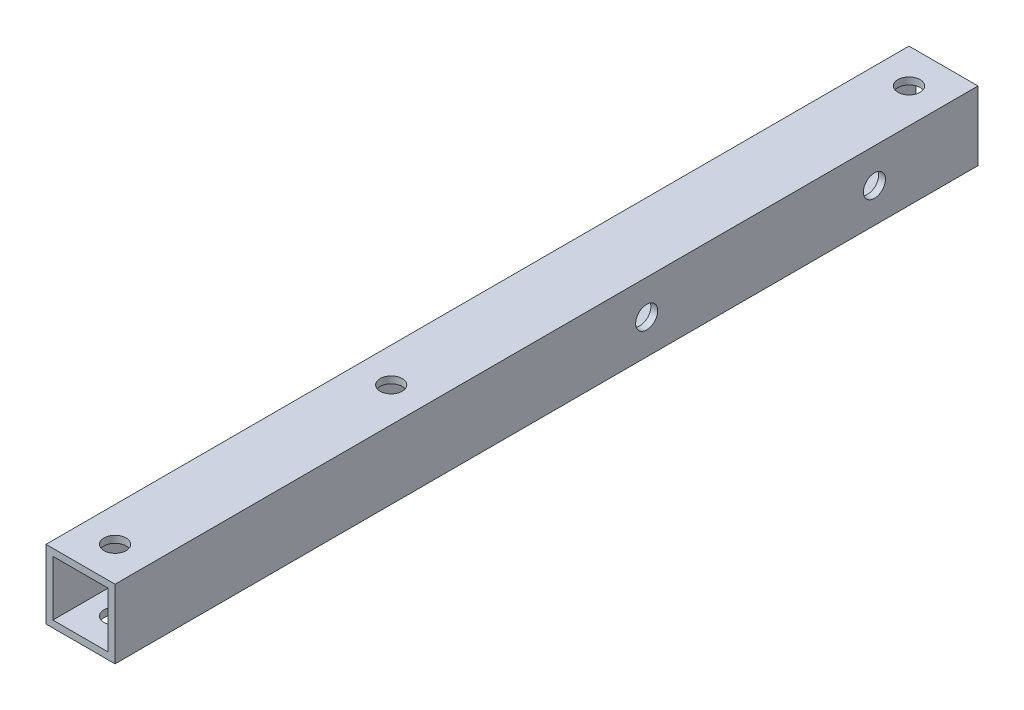
ISO-10303-21;
HEADER;
FILE_DESCRIPTION(('STEP AP214'),'2;1');
FILE_NAME('part.step','',(''),(''),'','','');
FILE_SCHEMA(('AUTOMOTIVE_DESIGN { 1 0 10303 214 1 1 1 1 }'));
ENDSEC;
DATA;
#1=APPLICATION_CONTEXT('core data for automotive mechanical design processes');
#2=APPLICATION_PROTOCOL_DEFINITION('international standard','automotive_design',2000,#1);
#3=PRODUCT_CONTEXT('',#1,'mechanical');
#4=PRODUCT('Part','Part','',(#3));
#5=PRODUCT_RELATED_PRODUCT_CATEGORY('part','',(#4));
#6=PRODUCT_DEFINITION_FORMATION('','',#4);
#7=PRODUCT_DEFINITION_CONTEXT('part definition',#1,'design');
#8=PRODUCT_DEFINITION('design','',#6,#7);
#9=PRODUCT_DEFINITION_SHAPE('','',#8);
#10=(LENGTH_UNIT() NAMED_UNIT(*) SI_UNIT(.MILLI.,.METRE.));
#11=(NAMED_UNIT(*) PLANE_ANGLE_UNIT() SI_UNIT($,.RADIAN.));
#12=(NAMED_UNIT(*) SI_UNIT($,.STERADIAN.) SOLID_ANGLE_UNIT());
#13=UNCERTAINTY_MEASURE_WITH_UNIT(LENGTH_MEASURE(1.E-05),#10,'distance_accuracy_value','');
#14=(GEOMETRIC_REPRESENTATION_CONTEXT(3) GLOBAL_UNCERTAINTY_ASSIGNED_CONTEXT((#13)) GLOBAL_UNIT_ASSIGNED_CONTEXT((#10,
#11,#12)) REPRESENTATION_CONTEXT('',''));
#15=CARTESIAN_POINT('',(0.,0.,0.));
#16=DIRECTION('',(0.,0.,1.));
#17=DIRECTION('',(1.,0.,0.));
#18=AXIS2_PLACEMENT_3D('',#15,#16,#17);
#19=CARTESIAN_POINT('',(0.,0.,125.));
#20=DIRECTION('',(0.,0.,1.));
#21=DIRECTION('',(1.,0.,0.));
#22=AXIS2_PLACEMENT_3D('',#19,#20,#21);
#23=PLANE('',#22);
#24=DIRECTION('',(0.,1.,0.));
#25=VECTOR('',#24,1.);
#26=CARTESIAN_POINT('',(5.,5.,125.));
#27=LINE('',#26,#25);
#28=CARTESIAN_POINT('',(5.,-5.,125.));
#29=VERTEX_POINT('',#28);
#30=CARTESIAN_POINT('',(5.,5.,125.));
#31=VERTEX_POINT('',#30);
#32=EDGE_CURVE('E140',#29,#31,#27,.T.);
#33=ORIENTED_EDGE('',*,*,#32,.T.);
#34=DIRECTION('',(-1.,0.,0.));
#35=VECTOR('',#34,1.);
#36=CARTESIAN_POINT('',(-5.,5.,125.));
#37=LINE('',#36,#35);
#38=CARTESIAN_POINT('',(-5.,5.,125.));
#39=VERTEX_POINT('',#38);
#40=EDGE_CURVE('E143',#31,#39,#37,.T.);
#41=ORIENTED_EDGE('',*,*,#40,.T.);
#42=DIRECTION('',(0.,-1.,0.));
#43=VECTOR('',#42,1.);
#44=CARTESIAN_POINT('',(-5.,5.,125.));
#45=LINE('',#44,#43);
#46=CARTESIAN_POINT('',(-5.,-5.,125.));
#47=VERTEX_POINT('',#46);
#48=EDGE_CURVE('E146',#39,#47,#45,.T.);
#49=ORIENTED_EDGE('',*,*,#48,.T.);
#50=DIRECTION('',(1.,0.,0.));
#51=VECTOR('',#50,1.);
#52=CARTESIAN_POINT('',(-5.,-5.,125.));
#53=LINE('',#52,#51);
#54=EDGE_CURVE('E148',#47,#29,#53,.T.);
#55=ORIENTED_EDGE('',*,*,#54,.T.);
#56=EDGE_LOOP('',(#33,#41,#49,#55));
#57=FACE_BOUND('',#56,.T.);
#58=DIRECTION('',(0.,-1.,0.));
#59=VECTOR('',#58,1.);
#60=CARTESIAN_POINT('',(-4.,4.,125.));
#61=LINE('',#60,#59);
#62=CARTESIAN_POINT('',(-4.,4.,125.));
#63=VERTEX_POINT('',#62);
#64=CARTESIAN_POINT('',(-4.,-4.,125.));
#65=VERTEX_POINT('',#64);
#66=EDGE_CURVE('E110',#63,#65,#61,.T.);
#67=ORIENTED_EDGE('',*,*,#66,.F.);
#68=DIRECTION('',(-1.,0.,0.));
#69=VECTOR('',#68,1.);
#70=CARTESIAN_POINT('',(-4.,4.,125.));
#71=LINE('',#70,#69);
#72=CARTESIAN_POINT('',(4.,4.,125.));
#73=VERTEX_POINT('',#72);
#74=EDGE_CURVE('E102',#73,#63,#71,.T.);
#75=ORIENTED_EDGE('',*,*,#74,.F.);
#76=DIRECTION('',(0.,1.,0.));
#77=VECTOR('',#76,1.);
#78=CARTESIAN_POINT('',(4.,4.,125.));
#79=LINE('',#78,#77);
#80=CARTESIAN_POINT('',(4.,-4.,125.));
#81=VERTEX_POINT('',#80);
#82=EDGE_CURVE('E124',#81,#73,#79,.T.);
#83=ORIENTED_EDGE('',*,*,#82,.F.);
#84=DIRECTION('',(1.,0.,0.));
#85=VECTOR('',#84,1.);
#86=CARTESIAN_POINT('',(-4.,-4.,125.));
#87=LINE('',#86,#85);
#88=EDGE_CURVE('E122',#65,#81,#87,.T.);
#89=ORIENTED_EDGE('',*,*,#88,.F.);
#90=EDGE_LOOP('',(#67,#75,#83,#89));
#91=FACE_BOUND('',#90,.T.);
#92=ADVANCED_FACE('F35',(#57,#91),#23,.T.);
#93=CARTESIAN_POINT('',(0.,0.,0.));
#94=DIRECTION('',(0.,0.,1.));
#95=DIRECTION('',(1.,0.,0.));
#96=AXIS2_PLACEMENT_3D('',#93,#94,#95);
#97=PLANE('',#96);
#98=DIRECTION('',(0.,1.,0.));
#99=VECTOR('',#98,1.);
#100=CARTESIAN_POINT('',(5.,5.,0.));
#101=LINE('',#100,#99);
#102=CARTESIAN_POINT('',(5.,-5.,0.));
#103=VERTEX_POINT('',#102);
#104=CARTESIAN_POINT('',(5.,5.,0.));
#105=VERTEX_POINT('',#104);
#106=EDGE_CURVE('E118',#103,#105,#101,.T.);
#107=ORIENTED_EDGE('',*,*,#106,.F.);
#108=DIRECTION('',(1.,0.,0.));
#109=VECTOR('',#108,1.);
#110=CARTESIAN_POINT('',(-5.,-5.,0.));
#111=LINE('',#110,#109);
#112=CARTESIAN_POINT('',(-5.,-5.,0.));
#113=VERTEX_POINT('',#112);
#114=EDGE_CURVE('E144',#113,#103,#111,.T.);
#115=ORIENTED_EDGE('',*,*,#114,.F.);
#116=DIRECTION('',(0.,-1.,0.));
#117=VECTOR('',#116,1.);
#118=CARTESIAN_POINT('',(-5.,5.,0.));
#119=LINE('',#118,#117);
#120=CARTESIAN_POINT('',(-5.,5.,0.));
#121=VERTEX_POINT('',#120);
#122=EDGE_CURVE('E155',#121,#113,#119,.T.);
#123=ORIENTED_EDGE('',*,*,#122,.F.);
#124=DIRECTION('',(-1.,0.,0.));
#125=VECTOR('',#124,1.);
#126=CARTESIAN_POINT('',(-5.,5.,0.));
#127=LINE('',#126,#125);
#128=EDGE_CURVE('E153',#105,#121,#127,.T.);
#129=ORIENTED_EDGE('',*,*,#128,.F.);
#130=EDGE_LOOP('',(#107,#115,#123,#129));
#131=FACE_BOUND('',#130,.T.);
#132=DIRECTION('',(-1.,0.,0.));
#133=VECTOR('',#132,1.);
#134=CARTESIAN_POINT('',(-4.,4.,0.));
#135=LINE('',#134,#133);
#136=CARTESIAN_POINT('',(4.,4.,0.));
#137=VERTEX_POINT('',#136);
#138=CARTESIAN_POINT('',(-4.,4.,0.));
#139=VERTEX_POINT('',#138);
#140=EDGE_CURVE('E60',#137,#139,#135,.T.);
#141=ORIENTED_EDGE('',*,*,#140,.T.);
#142=DIRECTION('',(0.,-1.,0.));
#143=VECTOR('',#142,1.);
#144=CARTESIAN_POINT('',(-4.,4.,0.));
#145=LINE('',#144,#143);
#146=CARTESIAN_POINT('',(-4.,-4.,0.));
#147=VERTEX_POINT('',#146);
#148=EDGE_CURVE('E117',#139,#147,#145,.T.);
#149=ORIENTED_EDGE('',*,*,#148,.T.);
#150=DIRECTION('',(1.,0.,0.));
#151=VECTOR('',#150,1.);
#152=CARTESIAN_POINT('',(-4.,-4.,0.));
#153=LINE('',#152,#151);
#154=CARTESIAN_POINT('',(4.,-4.,0.));
#155=VERTEX_POINT('',#154);
#156=EDGE_CURVE('E132',#147,#155,#153,.T.);
#157=ORIENTED_EDGE('',*,*,#156,.T.);
#158=DIRECTION('',(0.,1.,0.));
#159=VECTOR('',#158,1.);
#160=CARTESIAN_POINT('',(4.,4.,0.));
#161=LINE('',#160,#159);
#162=EDGE_CURVE('E111',#155,#137,#161,.T.);
#163=ORIENTED_EDGE('',*,*,#162,.T.);
#164=EDGE_LOOP('',(#141,#149,#157,#163));
#165=FACE_BOUND('',#164,.T.);
#166=ADVANCED_FACE('F252',(#131,#165),#97,.F.);
#167=CARTESIAN_POINT('',(5.,5.,125.));
#168=DIRECTION('',(-1.,0.,0.));
#169=DIRECTION('',(0.,-1.,0.));
#170=AXIS2_PLACEMENT_3D('',#167,#168,#169);
#171=PLANE('',#170);
#172=CARTESIAN_POINT('',(5.,0.,47.9898987322333));
#173=DIRECTION('',(1.,0.,0.));
#174=DIRECTION('',(0.,1.,0.));
#175=AXIS2_PLACEMENT_3D('',#172,#173,#174);
#176=CIRCLE('',#175,1.6);
#177=CARTESIAN_POINT('',(5.,1.60000000000005,47.9898987322333));
#178=VERTEX_POINT('',#177);
#179=EDGE_CURVE('E281',#178,#178,#176,.T.);
#180=ORIENTED_EDGE('',*,*,#179,.F.);
#181=EDGE_LOOP('',(#180));
#182=FACE_BOUND('',#181,.T.);
#183=CARTESIAN_POINT('',(5.,0.,15.));
#184=DIRECTION('',(1.,0.,0.));
#185=DIRECTION('',(0.,1.,0.));
#186=AXIS2_PLACEMENT_3D('',#183,#184,#185);
#187=CIRCLE('',#186,1.6);
#188=CARTESIAN_POINT('',(5.,1.6,15.));
#189=VERTEX_POINT('',#188);
#190=EDGE_CURVE('E186',#189,#189,#187,.T.);
#191=ORIENTED_EDGE('',*,*,#190,.F.);
#192=EDGE_LOOP('',(#191));
#193=FACE_BOUND('',#192,.T.);
#194=ORIENTED_EDGE('',*,*,#106,.T.);
#195=DIRECTION('',(0.,0.,-1.));
#196=VECTOR('',#195,1.);
#197=CARTESIAN_POINT('',(5.,5.,125.));
#198=LINE('',#197,#196);
#199=EDGE_CURVE('E11',#31,#105,#198,.T.);
#200=ORIENTED_EDGE('',*,*,#199,.F.);
#201=ORIENTED_EDGE('',*,*,#32,.F.);
#202=DIRECTION('',(0.,0.,-1.));
#203=VECTOR('',#202,1.);
#204=CARTESIAN_POINT('',(5.,-5.,125.));
#205=LINE('',#204,#203);
#206=EDGE_CURVE('E150',#29,#103,#205,.T.);
#207=ORIENTED_EDGE('',*,*,#206,.T.);
#208=EDGE_LOOP('',(#194,#200,#201,#207));
#209=FACE_BOUND('',#208,.T.);
#210=ADVANCED_FACE('F37',(#182,#193,#209),#171,.F.);
#211=CARTESIAN_POINT('',(-5.,5.,125.));
#212=DIRECTION('',(0.,-1.,0.));
#213=DIRECTION('',(0.,0.,-1.));
#214=AXIS2_PLACEMENT_3D('',#211,#212,#213);
#215=PLANE('',#214);
#216=CARTESIAN_POINT('',(0.,5.,5.));
#217=DIRECTION('',(0.,-1.,0.));
#218=DIRECTION('',(0.,0.,-1.));
#219=AXIS2_PLACEMENT_3D('',#216,#217,#218);
#220=CIRCLE('',#219,1.6);
#221=CARTESIAN_POINT('',(0.,5.,3.4));
#222=VERTEX_POINT('',#221);
#223=EDGE_CURVE('E169',#222,#222,#220,.T.);
#224=ORIENTED_EDGE('',*,*,#223,.T.);
#225=EDGE_LOOP('',(#224));
#226=FACE_BOUND('',#225,.T.);
#227=CARTESIAN_POINT('',(0.,5.,80.));
#228=DIRECTION('',(0.,-1.,0.));
#229=DIRECTION('',(0.,0.,-1.));
#230=AXIS2_PLACEMENT_3D('',#227,#228,#229);
#231=CIRCLE('',#230,1.6);
#232=CARTESIAN_POINT('',(0.,5.,78.4));
#233=VERTEX_POINT('',#232);
#234=EDGE_CURVE('E201',#233,#233,#231,.T.);
#235=ORIENTED_EDGE('',*,*,#234,.T.);
#236=EDGE_LOOP('',(#235));
#237=FACE_BOUND('',#236,.T.);
#238=CARTESIAN_POINT('',(0.,5.,120.));
#239=DIRECTION('',(0.,-1.,0.));
#240=DIRECTION('',(0.,0.,-1.));
#241=AXIS2_PLACEMENT_3D('',#238,#239,#240);
#242=CIRCLE('',#241,1.6);
#243=CARTESIAN_POINT('',(0.,5.,118.4));
#244=VERTEX_POINT('',#243);
#245=EDGE_CURVE('E207',#244,#244,#242,.T.);
#246=ORIENTED_EDGE('',*,*,#245,.T.);
#247=EDGE_LOOP('',(#246));
#248=FACE_BOUND('',#247,.T.);
#249=ORIENTED_EDGE('',*,*,#128,.T.);
#250=DIRECTION('',(0.,0.,-1.));
#251=VECTOR('',#250,1.);
#252=CARTESIAN_POINT('',(-5.,5.,125.));
#253=LINE('',#252,#251);
#254=EDGE_CURVE('E44',#39,#121,#253,.T.);
#255=ORIENTED_EDGE('',*,*,#254,.F.);
#256=ORIENTED_EDGE('',*,*,#40,.F.);
#257=ORIENTED_EDGE('',*,*,#199,.T.);
#258=EDGE_LOOP('',(#249,#255,#256,#257));
#259=FACE_BOUND('',#258,.T.);
#260=ADVANCED_FACE('F238',(#226,#237,#248,#259),#215,.F.);
#261=CARTESIAN_POINT('',(-5.,5.,125.));
#262=DIRECTION('',(1.,0.,0.));
#263=DIRECTION('',(0.,1.,0.));
#264=AXIS2_PLACEMENT_3D('',#261,#262,#263);
#265=PLANE('',#264);
#266=CARTESIAN_POINT('',(-5.00000000000001,0.,47.9898987322333));
#267=DIRECTION('',(1.,0.,0.));
#268=DIRECTION('',(0.,1.,0.));
#269=AXIS2_PLACEMENT_3D('',#266,#267,#268);
#270=CIRCLE('',#269,1.6);
#271=CARTESIAN_POINT('',(-5.00000000000001,1.60000000000005,47.9898987322333));
#272=VERTEX_POINT('',#271);
#273=EDGE_CURVE('E279',#272,#272,#270,.T.);
#274=ORIENTED_EDGE('',*,*,#273,.T.);
#275=EDGE_LOOP('',(#274));
#276=FACE_BOUND('',#275,.T.);
#277=CARTESIAN_POINT('',(-5.,0.,15.));
#278=DIRECTION('',(1.,0.,0.));
#279=DIRECTION('',(0.,1.,0.));
#280=AXIS2_PLACEMENT_3D('',#277,#278,#279);
#281=CIRCLE('',#280,1.6);
#282=CARTESIAN_POINT('',(-5.,1.6,15.));
#283=VERTEX_POINT('',#282);
#284=EDGE_CURVE('E179',#283,#283,#281,.T.);
#285=ORIENTED_EDGE('',*,*,#284,.T.);
#286=EDGE_LOOP('',(#285));
#287=FACE_BOUND('',#286,.T.);
#288=ORIENTED_EDGE('',*,*,#122,.T.);
#289=DIRECTION('',(0.,0.,-1.));
#290=VECTOR('',#289,1.);
#291=CARTESIAN_POINT('',(-5.,-5.,125.));
#292=LINE('',#291,#290);
#293=EDGE_CURVE('E160',#47,#113,#292,.T.);
#294=ORIENTED_EDGE('',*,*,#293,.F.);
#295=ORIENTED_EDGE('',*,*,#48,.F.);
#296=ORIENTED_EDGE('',*,*,#254,.T.);
#297=EDGE_LOOP('',(#288,#294,#295,#296));
#298=FACE_BOUND('',#297,.T.);
#299=ADVANCED_FACE('F241',(#276,#287,#298),#265,.F.);
#300=CARTESIAN_POINT('',(-5.,-5.,125.));
#301=DIRECTION('',(0.,1.,0.));
#302=DIRECTION('',(0.,0.,1.));
#303=AXIS2_PLACEMENT_3D('',#300,#301,#302);
#304=PLANE('',#303);
#305=CARTESIAN_POINT('',(0.,-5.,5.));
#306=DIRECTION('',(0.,-1.,0.));
#307=DIRECTION('',(0.,0.,-1.));
#308=AXIS2_PLACEMENT_3D('',#305,#306,#307);
#309=CIRCLE('',#308,1.6);
#310=CARTESIAN_POINT('',(0.,-5.,3.4));
#311=VERTEX_POINT('',#310);
#312=EDGE_CURVE('E198',#311,#311,#309,.T.);
#313=ORIENTED_EDGE('',*,*,#312,.F.);
#314=EDGE_LOOP('',(#313));
#315=FACE_BOUND('',#314,.T.);
#316=CARTESIAN_POINT('',(0.,-5.,80.));
#317=DIRECTION('',(0.,-1.,0.));
#318=DIRECTION('',(0.,0.,-1.));
#319=AXIS2_PLACEMENT_3D('',#316,#317,#318);
#320=CIRCLE('',#319,1.6);
#321=CARTESIAN_POINT('',(0.,-5.,78.4));
#322=VERTEX_POINT('',#321);
#323=EDGE_CURVE('E204',#322,#322,#320,.T.);
#324=ORIENTED_EDGE('',*,*,#323,.F.);
#325=EDGE_LOOP('',(#324));
#326=FACE_BOUND('',#325,.T.);
#327=CARTESIAN_POINT('',(0.,-5.,120.));
#328=DIRECTION('',(0.,-1.,0.));
#329=DIRECTION('',(0.,0.,-1.));
#330=AXIS2_PLACEMENT_3D('',#327,#328,#329);
#331=CIRCLE('',#330,1.6);
#332=CARTESIAN_POINT('',(0.,-5.,118.4));
#333=VERTEX_POINT('',#332);
#334=EDGE_CURVE('E183',#333,#333,#331,.T.);
#335=ORIENTED_EDGE('',*,*,#334,.F.);
#336=EDGE_LOOP('',(#335));
#337=FACE_BOUND('',#336,.T.);
#338=ORIENTED_EDGE('',*,*,#114,.T.);
#339=ORIENTED_EDGE('',*,*,#206,.F.);
#340=ORIENTED_EDGE('',*,*,#54,.F.);
#341=ORIENTED_EDGE('',*,*,#293,.T.);
#342=EDGE_LOOP('',(#338,#339,#340,#341));
#343=FACE_BOUND('',#342,.T.);
#344=ADVANCED_FACE('F223',(#315,#326,#337,#343),#304,.F.);
#345=CARTESIAN_POINT('',(-4.,4.,125.));
#346=DIRECTION('',(0.,-1.,0.));
#347=DIRECTION('',(0.,0.,-1.));
#348=AXIS2_PLACEMENT_3D('',#345,#346,#347);
#349=PLANE('',#348);
#350=CARTESIAN_POINT('',(0.,4.,5.));
#351=DIRECTION('',(0.,-1.,0.));
#352=DIRECTION('',(0.,0.,-1.));
#353=AXIS2_PLACEMENT_3D('',#350,#351,#352);
#354=CIRCLE('',#353,1.6);
#355=CARTESIAN_POINT('',(0.,4.,3.4));
#356=VERTEX_POINT('',#355);
#357=EDGE_CURVE('E130',#356,#356,#354,.T.);
#358=ORIENTED_EDGE('',*,*,#357,.F.);
#359=EDGE_LOOP('',(#358));
#360=FACE_BOUND('',#359,.T.);
#361=CARTESIAN_POINT('',(0.,4.,80.));
#362=DIRECTION('',(0.,-1.,0.));
#363=DIRECTION('',(0.,0.,-1.));
#364=AXIS2_PLACEMENT_3D('',#361,#362,#363);
#365=CIRCLE('',#364,1.6);
#366=CARTESIAN_POINT('',(0.,4.,78.4));
#367=VERTEX_POINT('',#366);
#368=EDGE_CURVE('E173',#367,#367,#365,.T.);
#369=ORIENTED_EDGE('',*,*,#368,.F.);
#370=EDGE_LOOP('',(#369));
#371=FACE_BOUND('',#370,.T.);
#372=CARTESIAN_POINT('',(0.,4.,120.));
#373=DIRECTION('',(0.,-1.,0.));
#374=DIRECTION('',(0.,0.,-1.));
#375=AXIS2_PLACEMENT_3D('',#372,#373,#374);
#376=CIRCLE('',#375,1.6);
#377=CARTESIAN_POINT('',(0.,4.,118.4));
#378=VERTEX_POINT('',#377);
#379=EDGE_CURVE('E168',#378,#378,#376,.T.);
#380=ORIENTED_EDGE('',*,*,#379,.F.);
#381=EDGE_LOOP('',(#380));
#382=FACE_BOUND('',#381,.T.);
#383=ORIENTED_EDGE('',*,*,#140,.F.);
#384=DIRECTION('',(0.,0.,-1.));
#385=VECTOR('',#384,1.);
#386=CARTESIAN_POINT('',(4.,4.,125.));
#387=LINE('',#386,#385);
#388=EDGE_CURVE('E106',#73,#137,#387,.T.);
#389=ORIENTED_EDGE('',*,*,#388,.F.);
#390=ORIENTED_EDGE('',*,*,#74,.T.);
#391=DIRECTION('',(0.,0.,-1.));
#392=VECTOR('',#391,1.);
#393=CARTESIAN_POINT('',(-4.,4.,125.));
#394=LINE('',#393,#392);
#395=EDGE_CURVE('E105',#63,#139,#394,.T.);
#396=ORIENTED_EDGE('',*,*,#395,.T.);
#397=EDGE_LOOP('',(#383,#389,#390,#396));
#398=FACE_BOUND('',#397,.T.);
#399=ADVANCED_FACE('F104',(#360,#371,#382,#398),#349,.T.);
#400=CARTESIAN_POINT('',(-4.,4.,125.));
#401=DIRECTION('',(1.,0.,0.));
#402=DIRECTION('',(0.,1.,0.));
#403=AXIS2_PLACEMENT_3D('',#400,#401,#402);
#404=PLANE('',#403);
#405=CARTESIAN_POINT('',(-4.,0.,47.9898987322333));
#406=DIRECTION('',(1.,0.,0.));
#407=DIRECTION('',(0.,1.,0.));
#408=AXIS2_PLACEMENT_3D('',#405,#406,#407);
#409=CIRCLE('',#408,1.6);
#410=CARTESIAN_POINT('',(-4.,1.60000000000005,47.9898987322333));
#411=VERTEX_POINT('',#410);
#412=EDGE_CURVE('E191',#411,#411,#409,.T.);
#413=ORIENTED_EDGE('',*,*,#412,.F.);
#414=EDGE_LOOP('',(#413));
#415=FACE_BOUND('',#414,.T.);
#416=CARTESIAN_POINT('',(-4.,0.,15.));
#417=DIRECTION('',(1.,0.,0.));
#418=DIRECTION('',(0.,1.,0.));
#419=AXIS2_PLACEMENT_3D('',#416,#417,#418);
#420=CIRCLE('',#419,1.6);
#421=CARTESIAN_POINT('',(-4.,1.6,15.));
#422=VERTEX_POINT('',#421);
#423=EDGE_CURVE('E178',#422,#422,#420,.T.);
#424=ORIENTED_EDGE('',*,*,#423,.F.);
#425=EDGE_LOOP('',(#424));
#426=FACE_BOUND('',#425,.T.);
#427=ORIENTED_EDGE('',*,*,#148,.F.);
#428=ORIENTED_EDGE('',*,*,#395,.F.);
#429=ORIENTED_EDGE('',*,*,#66,.T.);
#430=DIRECTION('',(0.,0.,-1.));
#431=VECTOR('',#430,1.);
#432=CARTESIAN_POINT('',(-4.,-4.,125.));
#433=LINE('',#432,#431);
#434=EDGE_CURVE('E119',#65,#147,#433,.T.);
#435=ORIENTED_EDGE('',*,*,#434,.T.);
#436=EDGE_LOOP('',(#427,#428,#429,#435));
#437=FACE_BOUND('',#436,.T.);
#438=ADVANCED_FACE('F114',(#415,#426,#437),#404,.T.);
#439=CARTESIAN_POINT('',(-4.,-4.,125.));
#440=DIRECTION('',(0.,1.,0.));
#441=DIRECTION('',(-1.,0.,0.));
#442=AXIS2_PLACEMENT_3D('',#439,#440,#441);
#443=PLANE('',#442);
#444=CARTESIAN_POINT('',(0.,-4.,5.));
#445=DIRECTION('',(0.,1.,0.));
#446=DIRECTION('',(-1.,0.,0.));
#447=AXIS2_PLACEMENT_3D('',#444,#445,#446);
#448=CIRCLE('',#447,1.6);
#449=CARTESIAN_POINT('',(-1.6,-4.,5.));
#450=VERTEX_POINT('',#449);
#451=EDGE_CURVE('E174',#450,#450,#448,.T.);
#452=ORIENTED_EDGE('',*,*,#451,.F.);
#453=EDGE_LOOP('',(#452));
#454=FACE_BOUND('',#453,.T.);
#455=CARTESIAN_POINT('',(0.,-4.,80.));
#456=DIRECTION('',(0.,1.,0.));
#457=DIRECTION('',(-1.,0.,0.));
#458=AXIS2_PLACEMENT_3D('',#455,#456,#457);
#459=CIRCLE('',#458,1.6);
#460=CARTESIAN_POINT('',(-1.6,-4.,80.));
#461=VERTEX_POINT('',#460);
#462=EDGE_CURVE('E170',#461,#461,#459,.T.);
#463=ORIENTED_EDGE('',*,*,#462,.F.);
#464=EDGE_LOOP('',(#463));
#465=FACE_BOUND('',#464,.T.);
#466=CARTESIAN_POINT('',(0.,-4.,120.));
#467=DIRECTION('',(0.,1.,0.));
#468=DIRECTION('',(-1.,0.,0.));
#469=AXIS2_PLACEMENT_3D('',#466,#467,#468);
#470=CIRCLE('',#469,1.6);
#471=CARTESIAN_POINT('',(-1.6,-4.,120.));
#472=VERTEX_POINT('',#471);
#473=EDGE_CURVE('E165',#472,#472,#470,.T.);
#474=ORIENTED_EDGE('',*,*,#473,.F.);
#475=EDGE_LOOP('',(#474));
#476=FACE_BOUND('',#475,.T.);
#477=ORIENTED_EDGE('',*,*,#156,.F.);
#478=ORIENTED_EDGE('',*,*,#434,.F.);
#479=ORIENTED_EDGE('',*,*,#88,.T.);
#480=DIRECTION('',(0.,0.,-1.));
#481=VECTOR('',#480,1.);
#482=CARTESIAN_POINT('',(4.,-4.,125.));
#483=LINE('',#482,#481);
#484=EDGE_CURVE('E52',#81,#155,#483,.T.);
#485=ORIENTED_EDGE('',*,*,#484,.T.);
#486=EDGE_LOOP('',(#477,#478,#479,#485));
#487=FACE_BOUND('',#486,.T.);
#488=ADVANCED_FACE('F315',(#454,#465,#476,#487),#443,.T.);
#489=CARTESIAN_POINT('',(4.,4.,125.));
#490=DIRECTION('',(-1.,0.,0.));
#491=DIRECTION('',(0.,-1.,0.));
#492=AXIS2_PLACEMENT_3D('',#489,#490,#491);
#493=PLANE('',#492);
#494=CARTESIAN_POINT('',(4.,0.,47.9898987322333));
#495=DIRECTION('',(-1.,0.,0.));
#496=DIRECTION('',(0.,-1.,0.));
#497=AXIS2_PLACEMENT_3D('',#494,#495,#496);
#498=CIRCLE('',#497,1.6);
#499=CARTESIAN_POINT('',(4.,-1.59999999999994,47.9898987322333));
#500=VERTEX_POINT('',#499);
#501=EDGE_CURVE('E39',#500,#500,#498,.T.);
#502=ORIENTED_EDGE('',*,*,#501,.F.);
#503=EDGE_LOOP('',(#502));
#504=FACE_BOUND('',#503,.T.);
#505=CARTESIAN_POINT('',(4.,0.,15.));
#506=DIRECTION('',(-1.,0.,0.));
#507=DIRECTION('',(0.,-1.,0.));
#508=AXIS2_PLACEMENT_3D('',#505,#506,#507);
#509=CIRCLE('',#508,1.6);
#510=CARTESIAN_POINT('',(4.,1.6,15.));
#511=VERTEX_POINT('',#510);
#512=EDGE_CURVE('E176',#511,#511,#509,.T.);
#513=ORIENTED_EDGE('',*,*,#512,.F.);
#514=EDGE_LOOP('',(#513));
#515=FACE_BOUND('',#514,.T.);
#516=ORIENTED_EDGE('',*,*,#162,.F.);
#517=ORIENTED_EDGE('',*,*,#484,.F.);
#518=ORIENTED_EDGE('',*,*,#82,.T.);
#519=ORIENTED_EDGE('',*,*,#388,.T.);
#520=EDGE_LOOP('',(#516,#517,#518,#519));
#521=FACE_BOUND('',#520,.T.);
#522=ADVANCED_FACE('F311',(#504,#515,#521),#493,.T.);
#523=CARTESIAN_POINT('',(0.,5.,120.));
#524=DIRECTION('',(0.,-1.,0.));
#525=DIRECTION('',(0.,0.,-1.));
#526=AXIS2_PLACEMENT_3D('',#523,#524,#525);
#527=CYLINDRICAL_SURFACE('',#526,1.6);
#528=ORIENTED_EDGE('',*,*,#473,.T.);
#529=EDGE_LOOP('',(#528));
#530=FACE_BOUND('',#529,.T.);
#531=ORIENTED_EDGE('',*,*,#334,.T.);
#532=EDGE_LOOP('',(#531));
#533=FACE_BOUND('',#532,.T.);
#534=ADVANCED_FACE('F235',(#530,#533),#527,.F.);
#535=CARTESIAN_POINT('',(0.,5.,80.));
#536=DIRECTION('',(0.,-1.,0.));
#537=DIRECTION('',(0.,0.,-1.));
#538=AXIS2_PLACEMENT_3D('',#535,#536,#537);
#539=CYLINDRICAL_SURFACE('',#538,1.6);
#540=ORIENTED_EDGE('',*,*,#462,.T.);
#541=EDGE_LOOP('',(#540));
#542=FACE_BOUND('',#541,.T.);
#543=ORIENTED_EDGE('',*,*,#323,.T.);
#544=EDGE_LOOP('',(#543));
#545=FACE_BOUND('',#544,.T.);
#546=ADVANCED_FACE('F305',(#542,#545),#539,.F.);
#547=CARTESIAN_POINT('',(0.,5.,5.));
#548=DIRECTION('',(0.,-1.,0.));
#549=DIRECTION('',(0.,0.,-1.));
#550=AXIS2_PLACEMENT_3D('',#547,#548,#549);
#551=CYLINDRICAL_SURFACE('',#550,1.6);
#552=ORIENTED_EDGE('',*,*,#451,.T.);
#553=EDGE_LOOP('',(#552));
#554=FACE_BOUND('',#553,.T.);
#555=ORIENTED_EDGE('',*,*,#312,.T.);
#556=EDGE_LOOP('',(#555));
#557=FACE_BOUND('',#556,.T.);
#558=ADVANCED_FACE('F233',(#554,#557),#551,.F.);
#559=ORIENTED_EDGE('',*,*,#379,.T.);
#560=EDGE_LOOP('',(#559));
#561=FACE_BOUND('',#560,.T.);
#562=ORIENTED_EDGE('',*,*,#245,.F.);
#563=EDGE_LOOP('',(#562));
#564=FACE_BOUND('',#563,.T.);
#565=ADVANCED_FACE('F229',(#561,#564),#527,.F.);
#566=ORIENTED_EDGE('',*,*,#368,.T.);
#567=EDGE_LOOP('',(#566));
#568=FACE_BOUND('',#567,.T.);
#569=ORIENTED_EDGE('',*,*,#234,.F.);
#570=EDGE_LOOP('',(#569));
#571=FACE_BOUND('',#570,.T.);
#572=ADVANCED_FACE('F232',(#568,#571),#539,.F.);
#573=ORIENTED_EDGE('',*,*,#357,.T.);
#574=EDGE_LOOP('',(#573));
#575=FACE_BOUND('',#574,.T.);
#576=ORIENTED_EDGE('',*,*,#223,.F.);
#577=EDGE_LOOP('',(#576));
#578=FACE_BOUND('',#577,.T.);
#579=ADVANCED_FACE('F218',(#575,#578),#551,.F.);
#580=CARTESIAN_POINT('',(-5.,0.,15.));
#581=DIRECTION('',(1.,0.,0.));
#582=DIRECTION('',(0.,1.,0.));
#583=AXIS2_PLACEMENT_3D('',#580,#581,#582);
#584=CYLINDRICAL_SURFACE('',#583,1.6);
#585=CARTESIAN_POINT('',(4.,1.6,15.));
#586=CARTESIAN_POINT('',(4.01041666666667,1.6,15.));
#587=CARTESIAN_POINT('',(4.02083333333333,1.6,15.));
#588=CARTESIAN_POINT('',(4.04166666666667,1.6,15.));
#589=CARTESIAN_POINT('',(4.05208333333333,1.6,15.));
#590=CARTESIAN_POINT('',(4.07291666666667,1.6,15.));
#591=CARTESIAN_POINT('',(4.08333333333333,1.6,15.));
#592=CARTESIAN_POINT('',(4.10416666666667,1.6,15.));
#593=CARTESIAN_POINT('',(4.11458333333333,1.6,15.));
#594=CARTESIAN_POINT('',(4.13541666666667,1.6,15.));
#595=CARTESIAN_POINT('',(4.14583333333333,1.6,15.));
#596=CARTESIAN_POINT('',(4.16666666666667,1.6,15.));
#597=CARTESIAN_POINT('',(4.17708333333333,1.6,15.));
#598=CARTESIAN_POINT('',(4.19791666666667,1.6,15.));
#599=CARTESIAN_POINT('',(4.20833333333333,1.6,15.));
#600=CARTESIAN_POINT('',(4.22916666666667,1.6,15.));
#601=CARTESIAN_POINT('',(4.23958333333333,1.6,15.));
#602=CARTESIAN_POINT('',(4.26041666666667,1.6,15.));
#603=CARTESIAN_POINT('',(4.27083333333333,1.6,15.));
#604=CARTESIAN_POINT('',(4.29166666666667,1.6,15.));
#605=CARTESIAN_POINT('',(4.30208333333333,1.6,15.));
#606=CARTESIAN_POINT('',(4.32291666666667,1.6,15.));
#607=CARTESIAN_POINT('',(4.33333333333333,1.6,15.));
#608=CARTESIAN_POINT('',(4.35416666666667,1.6,15.));
#609=CARTESIAN_POINT('',(4.36458333333333,1.6,15.));
#610=CARTESIAN_POINT('',(4.38541666666667,1.6,15.));
#611=CARTESIAN_POINT('',(4.39583333333333,1.6,15.));
#612=CARTESIAN_POINT('',(4.41666666666667,1.6,15.));
#613=CARTESIAN_POINT('',(4.42708333333333,1.6,15.));
#614=CARTESIAN_POINT('',(4.44791666666667,1.6,15.));
#615=CARTESIAN_POINT('',(4.45833333333333,1.6,15.));
#616=CARTESIAN_POINT('',(4.47916666666667,1.6,15.));
#617=CARTESIAN_POINT('',(4.48958333333333,1.6,15.));
#618=CARTESIAN_POINT('',(4.51041666666667,1.6,15.));
#619=CARTESIAN_POINT('',(4.52083333333333,1.6,15.));
#620=CARTESIAN_POINT('',(4.54166666666667,1.6,15.));
#621=CARTESIAN_POINT('',(4.55208333333333,1.6,15.));
#622=CARTESIAN_POINT('',(4.57291666666667,1.6,15.));
#623=CARTESIAN_POINT('',(4.58333333333333,1.6,15.));
#624=CARTESIAN_POINT('',(4.60416666666667,1.6,15.));
#625=CARTESIAN_POINT('',(4.61458333333333,1.6,15.));
#626=CARTESIAN_POINT('',(4.63541666666667,1.6,15.));
#627=CARTESIAN_POINT('',(4.64583333333333,1.6,15.));
#628=CARTESIAN_POINT('',(4.66666666666667,1.6,15.));
#629=CARTESIAN_POINT('',(4.67708333333333,1.6,15.));
#630=CARTESIAN_POINT('',(4.69791666666667,1.6,15.));
#631=CARTESIAN_POINT('',(4.70833333333333,1.6,15.));
#632=CARTESIAN_POINT('',(4.72916666666667,1.6,15.));
#633=CARTESIAN_POINT('',(4.73958333333333,1.6,15.));
#634=CARTESIAN_POINT('',(4.76041666666667,1.6,15.));
#635=CARTESIAN_POINT('',(4.77083333333333,1.6,15.));
#636=CARTESIAN_POINT('',(4.79166666666667,1.6,15.));
#637=CARTESIAN_POINT('',(4.80208333333333,1.6,15.));
#638=CARTESIAN_POINT('',(4.82291666666667,1.6,15.));
#639=CARTESIAN_POINT('',(4.83333333333333,1.6,15.));
#640=CARTESIAN_POINT('',(4.85416666666667,1.6,15.));
#641=CARTESIAN_POINT('',(4.86458333333333,1.6,15.));
#642=CARTESIAN_POINT('',(4.88541666666667,1.6,15.));
#643=CARTESIAN_POINT('',(4.89583333333333,1.6,15.));
#644=CARTESIAN_POINT('',(4.91666666666667,1.6,15.));
#645=CARTESIAN_POINT('',(4.92708333333333,1.6,15.));
#646=CARTESIAN_POINT('',(4.94791666666667,1.6,15.));
#647=CARTESIAN_POINT('',(4.95833333333333,1.6,15.));
#648=CARTESIAN_POINT('',(4.97916666666667,1.6,15.));
#649=CARTESIAN_POINT('',(4.98958333333333,1.6,15.));
#650=CARTESIAN_POINT('',(5.,1.6,15.));
#651=B_SPLINE_CURVE_WITH_KNOTS('',3,(#585,#586,#587,#588,#589,#590,#591,#592,#593,#594,#595,
#596,#597,#598,#599,#600,#601,#602,#603,#604,#605,#606,#607,#608,#609,#610,#611,#612,#613,#614,
#615,#616,#617,#618,#619,#620,#621,#622,#623,#624,#625,#626,#627,#628,#629,#630,#631,#632,#633,
#634,#635,#636,#637,#638,#639,#640,#641,#642,#643,#644,#645,#646,#647,#648,#649,#650),
.UNSPECIFIED.,.F.,.F.,(4,2,2,2,2,2,2,2,2,2,2,2,2,2,2,2,2,2,2,2,2,2,2,2,2,2,2,2,2,2,2,2,4),(0.,
0.03125,0.0625000000000001,0.0937500000000001,0.125,0.15625,0.1875,0.21875,0.25,0.28125,0.3125,
0.34375,0.375,0.40625,0.4375,0.46875,0.5,0.53125,0.5625,0.593750000000001,0.625000000000001,
0.656250000000001,0.687500000000001,0.718750000000001,0.750000000000001,0.781250000000001,
0.812500000000001,0.843750000000001,0.875000000000001,0.906250000000001,0.937500000000001,
0.968750000000001,1.),.UNSPECIFIED.);
#652=EDGE_CURVE('BSEAM292',#511,#189,#651,.T.);
#653=ORIENTED_EDGE('',*,*,#512,.T.);
#654=ORIENTED_EDGE('',*,*,#190,.T.);
#655=ORIENTED_EDGE('',*,*,#652,.T.);
#656=ORIENTED_EDGE('',*,*,#652,.F.);
#657=EDGE_LOOP('',(#653,#655,#654,#656));
#658=FACE_BOUND('',#657,.T.);
#659=ADVANCED_FACE('F292',(#658),#584,.F.);
#660=CARTESIAN_POINT('',(-4.,1.6,15.));
#661=CARTESIAN_POINT('',(-4.01041666666667,1.6,15.));
#662=CARTESIAN_POINT('',(-4.02083333333333,1.6,15.));
#663=CARTESIAN_POINT('',(-4.04166666666667,1.6,15.));
#664=CARTESIAN_POINT('',(-4.05208333333333,1.6,15.));
#665=CARTESIAN_POINT('',(-4.07291666666667,1.6,15.));
#666=CARTESIAN_POINT('',(-4.08333333333333,1.6,15.));
#667=CARTESIAN_POINT('',(-4.10416666666667,1.6,15.));
#668=CARTESIAN_POINT('',(-4.11458333333333,1.6,15.));
#669=CARTESIAN_POINT('',(-4.13541666666667,1.6,15.));
#670=CARTESIAN_POINT('',(-4.14583333333333,1.6,15.));
#671=CARTESIAN_POINT('',(-4.16666666666667,1.6,15.));
#672=CARTESIAN_POINT('',(-4.17708333333333,1.6,15.));
#673=CARTESIAN_POINT('',(-4.19791666666667,1.6,15.));
#674=CARTESIAN_POINT('',(-4.20833333333333,1.6,15.));
#675=CARTESIAN_POINT('',(-4.22916666666667,1.6,15.));
#676=CARTESIAN_POINT('',(-4.23958333333333,1.6,15.));
#677=CARTESIAN_POINT('',(-4.26041666666667,1.6,15.));
#678=CARTESIAN_POINT('',(-4.27083333333333,1.6,15.));
#679=CARTESIAN_POINT('',(-4.29166666666667,1.6,15.));
#680=CARTESIAN_POINT('',(-4.30208333333334,1.6,15.));
#681=CARTESIAN_POINT('',(-4.32291666666667,1.6,15.));
#682=CARTESIAN_POINT('',(-4.33333333333334,1.6,15.));
#683=CARTESIAN_POINT('',(-4.35416666666667,1.6,15.));
#684=CARTESIAN_POINT('',(-4.36458333333334,1.6,15.));
#685=CARTESIAN_POINT('',(-4.38541666666667,1.6,15.));
#686=CARTESIAN_POINT('',(-4.39583333333334,1.6,15.));
#687=CARTESIAN_POINT('',(-4.41666666666667,1.6,15.));
#688=CARTESIAN_POINT('',(-4.42708333333334,1.6,15.));
#689=CARTESIAN_POINT('',(-4.44791666666667,1.6,15.));
#690=CARTESIAN_POINT('',(-4.45833333333334,1.6,15.));
#691=CARTESIAN_POINT('',(-4.47916666666667,1.6,15.));
#692=CARTESIAN_POINT('',(-4.48958333333334,1.6,15.));
#693=CARTESIAN_POINT('',(-4.51041666666667,1.6,15.));
#694=CARTESIAN_POINT('',(-4.52083333333334,1.6,15.));
#695=CARTESIAN_POINT('',(-4.54166666666667,1.6,15.));
#696=CARTESIAN_POINT('',(-4.55208333333334,1.6,15.));
#697=CARTESIAN_POINT('',(-4.57291666666667,1.6,15.));
#698=CARTESIAN_POINT('',(-4.58333333333334,1.6,15.));
#699=CARTESIAN_POINT('',(-4.60416666666667,1.6,15.));
#700=CARTESIAN_POINT('',(-4.61458333333334,1.6,15.));
#701=CARTESIAN_POINT('',(-4.63541666666667,1.6,15.));
#702=CARTESIAN_POINT('',(-4.64583333333334,1.6,15.));
#703=CARTESIAN_POINT('',(-4.66666666666667,1.6,15.));
#704=CARTESIAN_POINT('',(-4.67708333333334,1.6,15.));
#705=CARTESIAN_POINT('',(-4.69791666666667,1.6,15.));
#706=CARTESIAN_POINT('',(-4.70833333333334,1.6,15.));
#707=CARTESIAN_POINT('',(-4.72916666666667,1.6,15.));
#708=CARTESIAN_POINT('',(-4.73958333333334,1.6,15.));
#709=CARTESIAN_POINT('',(-4.76041666666667,1.6,15.));
#710=CARTESIAN_POINT('',(-4.77083333333334,1.6,15.));
#711=CARTESIAN_POINT('',(-4.79166666666667,1.6,15.));
#712=CARTESIAN_POINT('',(-4.80208333333334,1.6,15.));
#713=CARTESIAN_POINT('',(-4.82291666666667,1.6,15.));
#714=CARTESIAN_POINT('',(-4.83333333333334,1.6,15.));
#715=CARTESIAN_POINT('',(-4.85416666666667,1.6,15.));
#716=CARTESIAN_POINT('',(-4.86458333333334,1.6,15.));
#717=CARTESIAN_POINT('',(-4.88541666666667,1.6,15.));
#718=CARTESIAN_POINT('',(-4.89583333333334,1.6,15.));
#719=CARTESIAN_POINT('',(-4.91666666666667,1.6,15.));
#720=CARTESIAN_POINT('',(-4.92708333333334,1.6,15.));
#721=CARTESIAN_POINT('',(-4.94791666666667,1.6,15.));
#722=CARTESIAN_POINT('',(-4.95833333333334,1.6,15.));
#723=CARTESIAN_POINT('',(-4.97916666666667,1.6,15.));
#724=CARTESIAN_POINT('',(-4.98958333333334,1.6,15.));
#725=CARTESIAN_POINT('',(-5.,1.6,15.));
#726=B_SPLINE_CURVE_WITH_KNOTS('',3,(#660,#661,#662,#663,#664,#665,#666,#667,#668,#669,#670,
#671,#672,#673,#674,#675,#676,#677,#678,#679,#680,#681,#682,#683,#684,#685,#686,#687,#688,#689,
#690,#691,#692,#693,#694,#695,#696,#697,#698,#699,#700,#701,#702,#703,#704,#705,#706,#707,#708,
#709,#710,#711,#712,#713,#714,#715,#716,#717,#718,#719,#720,#721,#722,#723,#724,#725),
.UNSPECIFIED.,.F.,.F.,(4,2,2,2,2,2,2,2,2,2,2,2,2,2,2,2,2,2,2,2,2,2,2,2,2,2,2,2,2,2,2,2,4),(0.,
0.03125,0.0625000000000001,0.0937500000000001,0.125,0.15625,0.1875,0.21875,0.25,
0.281250000000001,0.312500000000001,0.343750000000001,0.375000000000001,0.406250000000001,
0.437500000000001,0.468750000000001,0.500000000000001,0.531250000000001,0.562500000000001,
0.593750000000001,0.625000000000001,0.656250000000002,0.687500000000002,0.718750000000002,
0.750000000000002,0.781250000000002,0.812500000000002,0.843750000000002,0.875000000000003,
0.906250000000003,0.937500000000003,0.968750000000003,1.),.UNSPECIFIED.);
#727=EDGE_CURVE('BSEAM294',#422,#283,#726,.T.);
#728=ORIENTED_EDGE('',*,*,#423,.T.);
#729=ORIENTED_EDGE('',*,*,#284,.F.);
#730=ORIENTED_EDGE('',*,*,#727,.T.);
#731=ORIENTED_EDGE('',*,*,#727,.F.);
#732=EDGE_LOOP('',(#728,#730,#729,#731));
#733=FACE_BOUND('',#732,.T.);
#734=ADVANCED_FACE('F294',(#733),#584,.F.);
#735=CARTESIAN_POINT('',(-5.00000000000001,0.,47.9898987322333));
#736=DIRECTION('',(1.,0.,0.));
#737=DIRECTION('',(0.,1.,0.));
#738=AXIS2_PLACEMENT_3D('',#735,#736,#737);
#739=CYLINDRICAL_SURFACE('',#738,1.6);
#740=ORIENTED_EDGE('',*,*,#501,.T.);
#741=EDGE_LOOP('',(#740));
#742=FACE_BOUND('',#741,.T.);
#743=ORIENTED_EDGE('',*,*,#179,.T.);
#744=EDGE_LOOP('',(#743));
#745=FACE_BOUND('',#744,.T.);
#746=ADVANCED_FACE('F287',(#742,#745),#739,.F.);
#747=ORIENTED_EDGE('',*,*,#412,.T.);
#748=EDGE_LOOP('',(#747));
#749=FACE_BOUND('',#748,.T.);
#750=ORIENTED_EDGE('',*,*,#273,.F.);
#751=EDGE_LOOP('',(#750));
#752=FACE_BOUND('',#751,.T.);
#753=ADVANCED_FACE('F328',(#749,#752),#739,.F.);
#754=CLOSED_SHELL('',(#92,#166,#210,#260,#299,#344,#399,#438,#488,#522,#534,#546,#558,#565,#572,
#579,#659,#734,#746,#753));
#755=MANIFOLD_SOLID_BREP('B2',#754);
#756=ADVANCED_BREP_SHAPE_REPRESENTATION('',(#18,#755),#14);
#757=SHAPE_DEFINITION_REPRESENTATION(#9,#756);
ENDSEC;
END-ISO-10303-21;
